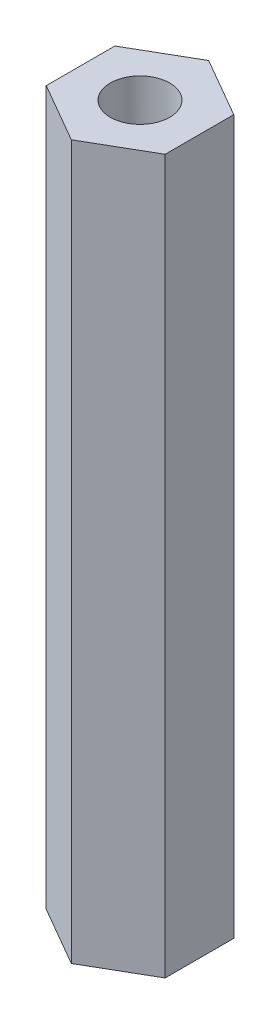
ISO-10303-21;
HEADER;
FILE_DESCRIPTION(('STEP AP214'),'2;1');
FILE_NAME('part.step','',(''),(''),'','','');
FILE_SCHEMA(('AUTOMOTIVE_DESIGN { 1 0 10303 214 1 1 1 1 }'));
ENDSEC;
DATA;
#1=APPLICATION_CONTEXT('core data for automotive mechanical design processes');
#2=APPLICATION_PROTOCOL_DEFINITION('international standard','automotive_design',2000,#1);
#3=PRODUCT_CONTEXT('',#1,'mechanical');
#4=PRODUCT('Part','Part','',(#3));
#5=PRODUCT_RELATED_PRODUCT_CATEGORY('part','',(#4));
#6=PRODUCT_DEFINITION_FORMATION('','',#4);
#7=PRODUCT_DEFINITION_CONTEXT('part definition',#1,'design');
#8=PRODUCT_DEFINITION('design','',#6,#7);
#9=PRODUCT_DEFINITION_SHAPE('','',#8);
#10=(LENGTH_UNIT() NAMED_UNIT(*) SI_UNIT(.MILLI.,.METRE.));
#11=(NAMED_UNIT(*) PLANE_ANGLE_UNIT() SI_UNIT($,.RADIAN.));
#12=(NAMED_UNIT(*) SI_UNIT($,.STERADIAN.) SOLID_ANGLE_UNIT());
#13=UNCERTAINTY_MEASURE_WITH_UNIT(LENGTH_MEASURE(1.E-05),#10,'distance_accuracy_value','');
#14=(GEOMETRIC_REPRESENTATION_CONTEXT(3) GLOBAL_UNCERTAINTY_ASSIGNED_CONTEXT((#13)) GLOBAL_UNIT_ASSIGNED_CONTEXT((#10,
#11,#12)) REPRESENTATION_CONTEXT('',''));
#15=CARTESIAN_POINT('',(0.,0.,0.));
#16=DIRECTION('',(0.,0.,1.));
#17=DIRECTION('',(1.,0.,0.));
#18=AXIS2_PLACEMENT_3D('',#15,#16,#17);
#19=CARTESIAN_POINT('',(-2.5,35.,-1.443375672974));
#20=DIRECTION('',(-0.499999999999983,0.,-0.866025403784448));
#21=DIRECTION('',(-0.866025403784448,0.,0.499999999999983));
#22=AXIS2_PLACEMENT_3D('',#19,#20,#21);
#23=PLANE('',#22);
#24=DIRECTION('',(-0.866025403784448,0.,0.499999999999983));
#25=VECTOR('',#24,1.);
#26=CARTESIAN_POINT('',(-2.5,30.,-1.443375672974));
#27=LINE('',#26,#25);
#28=CARTESIAN_POINT('',(0.,30.,-2.886751345948));
#29=VERTEX_POINT('',#28);
#30=CARTESIAN_POINT('',(-2.5,30.,-1.443375672974));
#31=VERTEX_POINT('',#30);
#32=EDGE_CURVE('E134',#29,#31,#27,.T.);
#33=ORIENTED_EDGE('',*,*,#32,.F.);
#34=DIRECTION('',(0.,-1.,0.));
#35=VECTOR('',#34,1.);
#36=CARTESIAN_POINT('',(0.,35.,-2.886751345948));
#37=LINE('',#36,#35);
#38=CARTESIAN_POINT('',(0.,0.,-2.886751345948));
#39=VERTEX_POINT('',#38);
#40=EDGE_CURVE('E103',#29,#39,#37,.T.);
#41=ORIENTED_EDGE('',*,*,#40,.T.);
#42=DIRECTION('',(0.866025403784448,0.,-0.499999999999983));
#43=VECTOR('',#42,1.);
#44=CARTESIAN_POINT('',(-2.5,0.,-1.443375672974));
#45=LINE('',#44,#43);
#46=CARTESIAN_POINT('',(-2.5,0.,-1.443375672974));
#47=VERTEX_POINT('',#46);
#48=EDGE_CURVE('E123',#47,#39,#45,.T.);
#49=ORIENTED_EDGE('',*,*,#48,.F.);
#50=DIRECTION('',(0.,-1.,0.));
#51=VECTOR('',#50,1.);
#52=CARTESIAN_POINT('',(-2.5,35.,-1.443375672974));
#53=LINE('',#52,#51);
#54=EDGE_CURVE('E11',#31,#47,#53,.T.);
#55=ORIENTED_EDGE('',*,*,#54,.F.);
#56=EDGE_LOOP('',(#33,#41,#49,#55));
#57=FACE_BOUND('',#56,.T.);
#58=ADVANCED_FACE('F17',(#57),#23,.T.);
#59=CARTESIAN_POINT('',(-2.5,35.,1.443375672974));
#60=DIRECTION('',(-1.,0.,0.));
#61=DIRECTION('',(0.,0.,1.));
#62=AXIS2_PLACEMENT_3D('',#59,#60,#61);
#63=PLANE('',#62);
#64=DIRECTION('',(0.,0.,1.));
#65=VECTOR('',#64,1.);
#66=CARTESIAN_POINT('',(-2.5,30.,1.443375672974));
#67=LINE('',#66,#65);
#68=CARTESIAN_POINT('',(-2.5,30.,1.44337567297399));
#69=VERTEX_POINT('',#68);
#70=EDGE_CURVE('E80',#31,#69,#67,.T.);
#71=ORIENTED_EDGE('',*,*,#70,.F.);
#72=ORIENTED_EDGE('',*,*,#54,.T.);
#73=DIRECTION('',(0.,0.,-1.));
#74=VECTOR('',#73,1.);
#75=CARTESIAN_POINT('',(-2.5,0.,1.443375672974));
#76=LINE('',#75,#74);
#77=CARTESIAN_POINT('',(-2.5,0.,1.443375672974));
#78=VERTEX_POINT('',#77);
#79=EDGE_CURVE('E104',#78,#47,#76,.T.);
#80=ORIENTED_EDGE('',*,*,#79,.F.);
#81=DIRECTION('',(0.,-1.,0.));
#82=VECTOR('',#81,1.);
#83=CARTESIAN_POINT('',(-2.5,35.,1.443375672974));
#84=LINE('',#83,#82);
#85=EDGE_CURVE('E25',#69,#78,#84,.T.);
#86=ORIENTED_EDGE('',*,*,#85,.F.);
#87=EDGE_LOOP('',(#71,#72,#80,#86));
#88=FACE_BOUND('',#87,.T.);
#89=ADVANCED_FACE('F159',(#88),#63,.T.);
#90=CARTESIAN_POINT('',(0.,35.,2.886751345948));
#91=DIRECTION('',(-0.499999999999983,0.,0.866025403784448));
#92=DIRECTION('',(0.866025403784448,0.,0.499999999999983));
#93=AXIS2_PLACEMENT_3D('',#90,#91,#92);
#94=PLANE('',#93);
#95=DIRECTION('',(0.866025403784448,0.,0.499999999999983));
#96=VECTOR('',#95,1.);
#97=CARTESIAN_POINT('',(0.,30.,2.886751345948));
#98=LINE('',#97,#96);
#99=CARTESIAN_POINT('',(0.,30.,2.886751345948));
#100=VERTEX_POINT('',#99);
#101=EDGE_CURVE('E75',#69,#100,#98,.T.);
#102=ORIENTED_EDGE('',*,*,#101,.F.);
#103=ORIENTED_EDGE('',*,*,#85,.T.);
#104=DIRECTION('',(-0.866025403784448,0.,-0.499999999999983));
#105=VECTOR('',#104,1.);
#106=CARTESIAN_POINT('',(0.,0.,2.886751345948));
#107=LINE('',#106,#105);
#108=CARTESIAN_POINT('',(0.,0.,2.886751345948));
#109=VERTEX_POINT('',#108);
#110=EDGE_CURVE('E96',#109,#78,#107,.T.);
#111=ORIENTED_EDGE('',*,*,#110,.F.);
#112=DIRECTION('',(0.,-1.,0.));
#113=VECTOR('',#112,1.);
#114=CARTESIAN_POINT('',(0.,35.,2.886751345948));
#115=LINE('',#114,#113);
#116=EDGE_CURVE('E90',#100,#109,#115,.T.);
#117=ORIENTED_EDGE('',*,*,#116,.F.);
#118=EDGE_LOOP('',(#102,#103,#111,#117));
#119=FACE_BOUND('',#118,.T.);
#120=ADVANCED_FACE('F94',(#119),#94,.T.);
#121=CARTESIAN_POINT('',(2.5,35.,1.443375672974));
#122=DIRECTION('',(0.499999999999983,0.,0.866025403784448));
#123=DIRECTION('',(0.866025403784448,0.,-0.499999999999983));
#124=AXIS2_PLACEMENT_3D('',#121,#122,#123);
#125=PLANE('',#124);
#126=DIRECTION('',(0.866025403784448,0.,-0.499999999999983));
#127=VECTOR('',#126,1.);
#128=CARTESIAN_POINT('',(-1.25000000000008,30.,3.60843918243505));
#129=LINE('',#128,#127);
#130=CARTESIAN_POINT('',(2.5,30.,1.443375672974));
#131=VERTEX_POINT('',#130);
#132=EDGE_CURVE('E79',#100,#131,#129,.T.);
#133=ORIENTED_EDGE('',*,*,#132,.F.);
#134=ORIENTED_EDGE('',*,*,#116,.T.);
#135=DIRECTION('',(-0.866025403784448,0.,0.499999999999983));
#136=VECTOR('',#135,1.);
#137=CARTESIAN_POINT('',(2.5,0.,1.443375672974));
#138=LINE('',#137,#136);
#139=CARTESIAN_POINT('',(2.5,0.,1.443375672974));
#140=VERTEX_POINT('',#139);
#141=EDGE_CURVE('E113',#140,#109,#138,.T.);
#142=ORIENTED_EDGE('',*,*,#141,.F.);
#143=DIRECTION('',(0.,-1.,0.));
#144=VECTOR('',#143,1.);
#145=CARTESIAN_POINT('',(2.5,35.,1.443375672974));
#146=LINE('',#145,#144);
#147=EDGE_CURVE('E92',#131,#140,#146,.T.);
#148=ORIENTED_EDGE('',*,*,#147,.F.);
#149=EDGE_LOOP('',(#133,#134,#142,#148));
#150=FACE_BOUND('',#149,.T.);
#151=ADVANCED_FACE('F88',(#150),#125,.T.);
#152=CARTESIAN_POINT('',(2.5,35.,-1.443375672974));
#153=DIRECTION('',(1.,0.,0.));
#154=DIRECTION('',(0.,0.,-1.));
#155=AXIS2_PLACEMENT_3D('',#152,#153,#154);
#156=PLANE('',#155);
#157=DIRECTION('',(0.,0.,-1.));
#158=VECTOR('',#157,1.);
#159=CARTESIAN_POINT('',(2.5,30.,-1.443375672974));
#160=LINE('',#159,#158);
#161=CARTESIAN_POINT('',(2.5,30.,-1.443375672974));
#162=VERTEX_POINT('',#161);
#163=EDGE_CURVE('E33',#131,#162,#160,.T.);
#164=ORIENTED_EDGE('',*,*,#163,.F.);
#165=ORIENTED_EDGE('',*,*,#147,.T.);
#166=DIRECTION('',(0.,0.,1.));
#167=VECTOR('',#166,1.);
#168=CARTESIAN_POINT('',(2.5,0.,-1.443375672974));
#169=LINE('',#168,#167);
#170=CARTESIAN_POINT('',(2.5,0.,-1.443375672974));
#171=VERTEX_POINT('',#170);
#172=EDGE_CURVE('E117',#171,#140,#169,.T.);
#173=ORIENTED_EDGE('',*,*,#172,.F.);
#174=DIRECTION('',(0.,-1.,0.));
#175=VECTOR('',#174,1.);
#176=CARTESIAN_POINT('',(2.5,35.,-1.443375672974));
#177=LINE('',#176,#175);
#178=EDGE_CURVE('E100',#162,#171,#177,.T.);
#179=ORIENTED_EDGE('',*,*,#178,.F.);
#180=EDGE_LOOP('',(#164,#165,#173,#179));
#181=FACE_BOUND('',#180,.T.);
#182=ADVANCED_FACE('F180',(#181),#156,.T.);
#183=CARTESIAN_POINT('',(0.,35.,-2.886751345948));
#184=DIRECTION('',(0.499999999999983,0.,-0.866025403784448));
#185=DIRECTION('',(-0.866025403784448,0.,-0.499999999999983));
#186=AXIS2_PLACEMENT_3D('',#183,#184,#185);
#187=PLANE('',#186);
#188=DIRECTION('',(-0.866025403784448,0.,-0.499999999999983));
#189=VECTOR('',#188,1.);
#190=CARTESIAN_POINT('',(0.,30.,-2.886751345948));
#191=LINE('',#190,#189);
#192=EDGE_CURVE('E137',#162,#29,#191,.T.);
#193=ORIENTED_EDGE('',*,*,#192,.F.);
#194=ORIENTED_EDGE('',*,*,#178,.T.);
#195=DIRECTION('',(0.866025403784448,0.,0.499999999999983));
#196=VECTOR('',#195,1.);
#197=CARTESIAN_POINT('',(0.,0.,-2.886751345948));
#198=LINE('',#197,#196);
#199=EDGE_CURVE('E120',#39,#171,#198,.T.);
#200=ORIENTED_EDGE('',*,*,#199,.F.);
#201=ORIENTED_EDGE('',*,*,#40,.F.);
#202=EDGE_LOOP('',(#193,#194,#200,#201));
#203=FACE_BOUND('',#202,.T.);
#204=ADVANCED_FACE('F166',(#203),#187,.T.);
#205=CARTESIAN_POINT('',(0.,0.,0.));
#206=DIRECTION('',(0.,-1.,0.));
#207=DIRECTION('',(0.,0.,-1.));
#208=AXIS2_PLACEMENT_3D('',#205,#206,#207);
#209=PLANE('',#208);
#210=CARTESIAN_POINT('',(0.,0.,0.));
#211=DIRECTION('',(0.,-1.,0.));
#212=DIRECTION('',(0.,0.,-1.));
#213=AXIS2_PLACEMENT_3D('',#210,#211,#212);
#214=CIRCLE('',#213,1.25);
#215=CARTESIAN_POINT('',(0.,0.,-1.25));
#216=VERTEX_POINT('',#215);
#217=EDGE_CURVE('E84',#216,#216,#214,.T.);
#218=ORIENTED_EDGE('',*,*,#217,.F.);
#219=EDGE_LOOP('',(#218));
#220=FACE_BOUND('',#219,.T.);
#221=ORIENTED_EDGE('',*,*,#48,.T.);
#222=ORIENTED_EDGE('',*,*,#199,.T.);
#223=ORIENTED_EDGE('',*,*,#172,.T.);
#224=ORIENTED_EDGE('',*,*,#141,.T.);
#225=ORIENTED_EDGE('',*,*,#110,.T.);
#226=ORIENTED_EDGE('',*,*,#79,.T.);
#227=EDGE_LOOP('',(#221,#222,#223,#224,#225,#226));
#228=FACE_BOUND('',#227,.T.);
#229=ADVANCED_FACE('F169',(#220,#228),#209,.T.);
#230=CARTESIAN_POINT('',(0.,10.00000000001,0.));
#231=DIRECTION('',(0.,-1.,0.));
#232=DIRECTION('',(0.,0.,-1.));
#233=AXIS2_PLACEMENT_3D('',#230,#231,#232);
#234=CONICAL_SURFACE('',#233,1.24999999999999,1.0297442587);
#235=CARTESIAN_POINT('',(0.,10.7510757737547,0.));
#236=VERTEX_POINT('',#235);
#237=VERTEX_LOOP('',#236);
#238=FACE_BOUND('',#237,.T.);
#239=CARTESIAN_POINT('',(0.,10.00000000001,0.));
#240=DIRECTION('',(0.,-1.,0.));
#241=DIRECTION('',(0.,0.,-1.));
#242=AXIS2_PLACEMENT_3D('',#239,#240,#241);
#243=CIRCLE('',#242,1.24999999999999);
#244=CARTESIAN_POINT('',(0.,10.00000000001,-1.24999999999999));
#245=VERTEX_POINT('',#244);
#246=EDGE_CURVE('E128',#245,#245,#243,.T.);
#247=ORIENTED_EDGE('',*,*,#246,.T.);
#248=EDGE_LOOP('',(#247));
#249=FACE_BOUND('',#248,.T.);
#250=ADVANCED_FACE('F155',(#238,#249),#234,.F.);
#251=CARTESIAN_POINT('',(0.,0.,0.));
#252=DIRECTION('',(0.,-1.,0.));
#253=DIRECTION('',(0.,0.,-1.));
#254=AXIS2_PLACEMENT_3D('',#251,#252,#253);
#255=CYLINDRICAL_SURFACE('',#254,1.24999999999999);
#256=ORIENTED_EDGE('',*,*,#246,.F.);
#257=EDGE_LOOP('',(#256));
#258=FACE_BOUND('',#257,.T.);
#259=ORIENTED_EDGE('',*,*,#217,.T.);
#260=EDGE_LOOP('',(#259));
#261=FACE_BOUND('',#260,.T.);
#262=ADVANCED_FACE('F145',(#258,#261),#255,.F.);
#263=CARTESIAN_POINT('',(-6.24999999999992,30.,-5.05181485540944));
#264=DIRECTION('',(0.,-1.,0.));
#265=DIRECTION('',(0.,0.,-1.));
#266=AXIS2_PLACEMENT_3D('',#263,#264,#265);
#267=PLANE('',#266);
#268=ORIENTED_EDGE('',*,*,#101,.T.);
#269=ORIENTED_EDGE('',*,*,#132,.T.);
#270=ORIENTED_EDGE('',*,*,#163,.T.);
#271=ORIENTED_EDGE('',*,*,#192,.T.);
#272=ORIENTED_EDGE('',*,*,#32,.T.);
#273=ORIENTED_EDGE('',*,*,#70,.T.);
#274=EDGE_LOOP('',(#268,#269,#270,#271,#272,#273));
#275=FACE_BOUND('',#274,.T.);
#276=CARTESIAN_POINT('',(0.,30.,0.));
#277=DIRECTION('',(0.,-1.,0.));
#278=DIRECTION('',(0.,0.,-1.));
#279=AXIS2_PLACEMENT_3D('',#276,#277,#278);
#280=CIRCLE('',#279,1.24999999999999);
#281=CARTESIAN_POINT('',(0.,30.,-1.24999999999999));
#282=VERTEX_POINT('',#281);
#283=EDGE_CURVE('E20',#282,#282,#280,.F.);
#284=ORIENTED_EDGE('',*,*,#283,.F.);
#285=EDGE_LOOP('',(#284));
#286=FACE_BOUND('',#285,.T.);
#287=ADVANCED_FACE('F77',(#275,#286),#267,.F.);
#288=CARTESIAN_POINT('',(0.,25.,0.));
#289=DIRECTION('',(0.,1.,0.));
#290=DIRECTION('',(0.,0.,1.));
#291=AXIS2_PLACEMENT_3D('',#288,#289,#290);
#292=CONICAL_SURFACE('',#291,1.24999999999999,1.0297442587);
#293=CARTESIAN_POINT('',(0.,24.2489242262553,0.));
#294=VERTEX_POINT('',#293);
#295=VERTEX_LOOP('',#294);
#296=FACE_BOUND('',#295,.T.);
#297=CARTESIAN_POINT('',(0.,25.,0.));
#298=DIRECTION('',(0.,1.,0.));
#299=DIRECTION('',(0.,0.,1.));
#300=AXIS2_PLACEMENT_3D('',#297,#298,#299);
#301=CIRCLE('',#300,1.24999999999999);
#302=CARTESIAN_POINT('',(0.,25.,1.24999999999999));
#303=VERTEX_POINT('',#302);
#304=EDGE_CURVE('E125',#303,#303,#301,.T.);
#305=ORIENTED_EDGE('',*,*,#304,.T.);
#306=EDGE_LOOP('',(#305));
#307=FACE_BOUND('',#306,.T.);
#308=ADVANCED_FACE('F144',(#296,#307),#292,.F.);
#309=CARTESIAN_POINT('',(0.,35.,0.));
#310=DIRECTION('',(0.,1.,0.));
#311=DIRECTION('',(0.,0.,1.));
#312=AXIS2_PLACEMENT_3D('',#309,#310,#311);
#313=CYLINDRICAL_SURFACE('',#312,1.24999999999999);
#314=ORIENTED_EDGE('',*,*,#283,.T.);
#315=EDGE_LOOP('',(#314));
#316=FACE_BOUND('',#315,.T.);
#317=ORIENTED_EDGE('',*,*,#304,.F.);
#318=EDGE_LOOP('',(#317));
#319=FACE_BOUND('',#318,.T.);
#320=ADVANCED_FACE('F141',(#316,#319),#313,.F.);
#321=CLOSED_SHELL('',(#58,#89,#120,#151,#182,#204,#229,#250,#262,#287,#308,#320));
#322=MANIFOLD_SOLID_BREP('B1',#321);
#323=ADVANCED_BREP_SHAPE_REPRESENTATION('',(#18,#322),#14);
#324=SHAPE_DEFINITION_REPRESENTATION(#9,#323);
ENDSEC;
END-ISO-10303-21;
